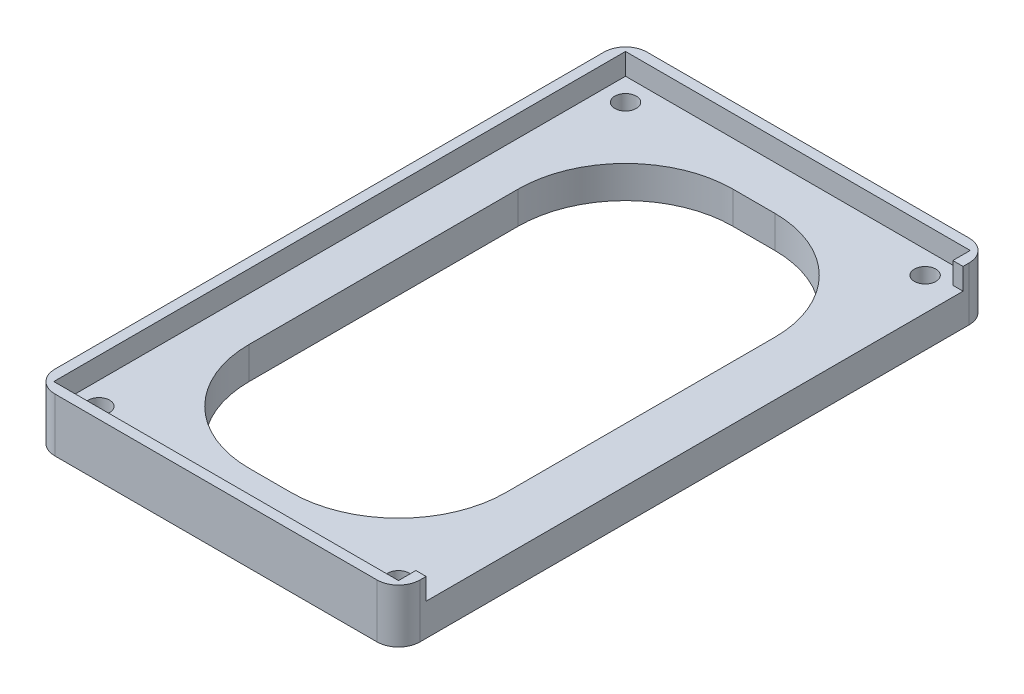
ISO-10303-21;
HEADER;
FILE_DESCRIPTION(('STEP AP214'),'2;1');
FILE_NAME('part.step','',(''),(''),'','','');
FILE_SCHEMA(('AUTOMOTIVE_DESIGN { 1 0 10303 214 1 1 1 1 }'));
ENDSEC;
DATA;
#1=APPLICATION_CONTEXT('core data for automotive mechanical design processes');
#2=APPLICATION_PROTOCOL_DEFINITION('international standard','automotive_design',2000,#1);
#3=PRODUCT_CONTEXT('',#1,'mechanical');
#4=PRODUCT('Part','Part','',(#3));
#5=PRODUCT_RELATED_PRODUCT_CATEGORY('part','',(#4));
#6=PRODUCT_DEFINITION_FORMATION('','',#4);
#7=PRODUCT_DEFINITION_CONTEXT('part definition',#1,'design');
#8=PRODUCT_DEFINITION('design','',#6,#7);
#9=PRODUCT_DEFINITION_SHAPE('','',#8);
#10=(LENGTH_UNIT() NAMED_UNIT(*) SI_UNIT(.MILLI.,.METRE.));
#11=(NAMED_UNIT(*) PLANE_ANGLE_UNIT() SI_UNIT($,.RADIAN.));
#12=(NAMED_UNIT(*) SI_UNIT($,.STERADIAN.) SOLID_ANGLE_UNIT());
#13=UNCERTAINTY_MEASURE_WITH_UNIT(LENGTH_MEASURE(1.E-05),#10,'distance_accuracy_value','');
#14=(GEOMETRIC_REPRESENTATION_CONTEXT(3) GLOBAL_UNCERTAINTY_ASSIGNED_CONTEXT((#13)) GLOBAL_UNIT_ASSIGNED_CONTEXT((#10,
#11,#12)) REPRESENTATION_CONTEXT('',''));
#15=CARTESIAN_POINT('',(0.,0.,0.));
#16=DIRECTION('',(0.,0.,1.));
#17=DIRECTION('',(1.,0.,0.));
#18=AXIS2_PLACEMENT_3D('',#15,#16,#17);
#19=CARTESIAN_POINT('',(15.05,10.,-15.05));
#20=DIRECTION('',(0.,1.,0.));
#21=DIRECTION('',(0.,0.,1.));
#22=AXIS2_PLACEMENT_3D('',#19,#20,#21);
#23=CYLINDRICAL_SURFACE('',#22,10.);
#24=DIRECTION('',(0.,1.,0.));
#25=VECTOR('',#24,1.);
#26=CARTESIAN_POINT('',(15.05,10.,-5.05));
#27=LINE('',#26,#25);
#28=CARTESIAN_POINT('',(15.05,0.,-5.05));
#29=VERTEX_POINT('',#28);
#30=CARTESIAN_POINT('',(15.05,3.,-5.05));
#31=VERTEX_POINT('',#30);
#32=EDGE_CURVE('E377',#29,#31,#27,.T.);
#33=ORIENTED_EDGE('',*,*,#32,.F.);
#34=CARTESIAN_POINT('',(15.05,0.,-15.05));
#35=DIRECTION('',(0.,-1.,0.));
#36=DIRECTION('',(0.,0.,-1.));
#37=AXIS2_PLACEMENT_3D('',#34,#35,#36);
#38=CIRCLE('',#37,10.);
#39=CARTESIAN_POINT('',(5.05,0.,-15.05));
#40=VERTEX_POINT('',#39);
#41=EDGE_CURVE('E54',#29,#40,#38,.T.);
#42=ORIENTED_EDGE('',*,*,#41,.T.);
#43=DIRECTION('',(0.,1.,0.));
#44=VECTOR('',#43,1.);
#45=CARTESIAN_POINT('',(5.05,10.,-15.05));
#46=LINE('',#45,#44);
#47=CARTESIAN_POINT('',(5.05,3.,-15.05));
#48=VERTEX_POINT('',#47);
#49=EDGE_CURVE('E381',#48,#40,#46,.F.);
#50=ORIENTED_EDGE('',*,*,#49,.F.);
#51=CARTESIAN_POINT('',(15.05,3.,-15.05));
#52=DIRECTION('',(0.,1.,0.));
#53=DIRECTION('',(0.,0.,1.));
#54=AXIS2_PLACEMENT_3D('',#51,#52,#53);
#55=CIRCLE('',#54,10.);
#56=EDGE_CURVE('E11',#48,#31,#55,.T.);
#57=ORIENTED_EDGE('',*,*,#56,.T.);
#58=EDGE_LOOP('',(#33,#42,#50,#57));
#59=FACE_BOUND('',#58,.T.);
#60=ADVANCED_FACE('F46',(#59),#23,.F.);
#61=CARTESIAN_POINT('',(18.95,10.,-15.05));
#62=DIRECTION('',(0.,-1.,0.));
#63=DIRECTION('',(0.,0.,-1.));
#64=AXIS2_PLACEMENT_3D('',#61,#62,#63);
#65=CYLINDRICAL_SURFACE('',#64,10.);
#66=DIRECTION('',(0.,1.,0.));
#67=VECTOR('',#66,1.);
#68=CARTESIAN_POINT('',(28.95,10.,-15.05));
#69=LINE('',#68,#67);
#70=CARTESIAN_POINT('',(28.95,0.,-15.05));
#71=VERTEX_POINT('',#70);
#72=CARTESIAN_POINT('',(28.95,3.,-15.05));
#73=VERTEX_POINT('',#72);
#74=EDGE_CURVE('E362',#71,#73,#69,.T.);
#75=ORIENTED_EDGE('',*,*,#74,.F.);
#76=CARTESIAN_POINT('',(18.95,0.,-15.05));
#77=DIRECTION('',(0.,-1.,0.));
#78=DIRECTION('',(0.,0.,-1.));
#79=AXIS2_PLACEMENT_3D('',#76,#77,#78);
#80=CIRCLE('',#79,10.);
#81=CARTESIAN_POINT('',(18.95,0.,-5.05));
#82=VERTEX_POINT('',#81);
#83=EDGE_CURVE('E370',#71,#82,#80,.T.);
#84=ORIENTED_EDGE('',*,*,#83,.T.);
#85=DIRECTION('',(0.,1.,0.));
#86=VECTOR('',#85,1.);
#87=CARTESIAN_POINT('',(18.95,10.,-5.05));
#88=LINE('',#87,#86);
#89=CARTESIAN_POINT('',(18.95,3.,-5.05));
#90=VERTEX_POINT('',#89);
#91=EDGE_CURVE('E366',#90,#82,#88,.F.);
#92=ORIENTED_EDGE('',*,*,#91,.F.);
#93=CARTESIAN_POINT('',(18.95,3.,-15.05));
#94=DIRECTION('',(0.,1.,0.));
#95=DIRECTION('',(0.,0.,1.));
#96=AXIS2_PLACEMENT_3D('',#93,#94,#95);
#97=CIRCLE('',#96,10.);
#98=EDGE_CURVE('E374',#90,#73,#97,.T.);
#99=ORIENTED_EDGE('',*,*,#98,.T.);
#100=EDGE_LOOP('',(#75,#84,#92,#99));
#101=FACE_BOUND('',#100,.T.);
#102=ADVANCED_FACE('F566',(#101),#65,.F.);
#103=CARTESIAN_POINT('',(15.05,10.,-40.09));
#104=DIRECTION('',(0.,1.,0.));
#105=DIRECTION('',(0.,0.,1.));
#106=AXIS2_PLACEMENT_3D('',#103,#104,#105);
#107=CYLINDRICAL_SURFACE('',#106,10.);
#108=DIRECTION('',(0.,-1.,0.));
#109=VECTOR('',#108,1.);
#110=CARTESIAN_POINT('',(15.05,10.,-50.09));
#111=LINE('',#110,#109);
#112=CARTESIAN_POINT('',(15.05,3.,-50.09));
#113=VERTEX_POINT('',#112);
#114=CARTESIAN_POINT('',(15.05,0.,-50.09));
#115=VERTEX_POINT('',#114);
#116=EDGE_CURVE('E348',#113,#115,#111,.T.);
#117=ORIENTED_EDGE('',*,*,#116,.F.);
#118=CARTESIAN_POINT('',(15.05,3.,-40.09));
#119=DIRECTION('',(0.,1.,0.));
#120=DIRECTION('',(0.,0.,1.));
#121=AXIS2_PLACEMENT_3D('',#118,#119,#120);
#122=CIRCLE('',#121,10.);
#123=CARTESIAN_POINT('',(5.05,3.,-40.09));
#124=VERTEX_POINT('',#123);
#125=EDGE_CURVE('E356',#113,#124,#122,.T.);
#126=ORIENTED_EDGE('',*,*,#125,.T.);
#127=DIRECTION('',(0.,-1.,0.));
#128=VECTOR('',#127,1.);
#129=CARTESIAN_POINT('',(5.05,10.,-40.09));
#130=LINE('',#129,#128);
#131=CARTESIAN_POINT('',(5.05,0.,-40.09));
#132=VERTEX_POINT('',#131);
#133=EDGE_CURVE('E352',#132,#124,#130,.F.);
#134=ORIENTED_EDGE('',*,*,#133,.F.);
#135=CARTESIAN_POINT('',(15.05,0.,-40.09));
#136=DIRECTION('',(0.,-1.,0.));
#137=DIRECTION('',(0.,0.,-1.));
#138=AXIS2_PLACEMENT_3D('',#135,#136,#137);
#139=CIRCLE('',#138,10.);
#140=EDGE_CURVE('E359',#132,#115,#139,.T.);
#141=ORIENTED_EDGE('',*,*,#140,.T.);
#142=EDGE_LOOP('',(#117,#126,#134,#141));
#143=FACE_BOUND('',#142,.T.);
#144=ADVANCED_FACE('F572',(#143),#107,.F.);
#145=CARTESIAN_POINT('',(18.95,10.,-40.09));
#146=DIRECTION('',(0.,-1.,0.));
#147=DIRECTION('',(0.,0.,-1.));
#148=AXIS2_PLACEMENT_3D('',#145,#146,#147);
#149=CYLINDRICAL_SURFACE('',#148,10.);
#150=DIRECTION('',(0.,-1.,0.));
#151=VECTOR('',#150,1.);
#152=CARTESIAN_POINT('',(28.95,10.,-40.09));
#153=LINE('',#152,#151);
#154=CARTESIAN_POINT('',(28.95,3.,-40.09));
#155=VERTEX_POINT('',#154);
#156=CARTESIAN_POINT('',(28.95,0.,-40.09));
#157=VERTEX_POINT('',#156);
#158=EDGE_CURVE('E333',#155,#157,#153,.T.);
#159=ORIENTED_EDGE('',*,*,#158,.F.);
#160=CARTESIAN_POINT('',(18.95,3.,-40.09));
#161=DIRECTION('',(0.,1.,0.));
#162=DIRECTION('',(0.,0.,1.));
#163=AXIS2_PLACEMENT_3D('',#160,#161,#162);
#164=CIRCLE('',#163,10.);
#165=CARTESIAN_POINT('',(18.95,3.,-50.09));
#166=VERTEX_POINT('',#165);
#167=EDGE_CURVE('E341',#155,#166,#164,.T.);
#168=ORIENTED_EDGE('',*,*,#167,.T.);
#169=DIRECTION('',(0.,-1.,0.));
#170=VECTOR('',#169,1.);
#171=CARTESIAN_POINT('',(18.95,10.,-50.09));
#172=LINE('',#171,#170);
#173=CARTESIAN_POINT('',(18.95,0.,-50.09));
#174=VERTEX_POINT('',#173);
#175=EDGE_CURVE('E337',#174,#166,#172,.F.);
#176=ORIENTED_EDGE('',*,*,#175,.F.);
#177=CARTESIAN_POINT('',(18.95,0.,-40.09));
#178=DIRECTION('',(0.,-1.,0.));
#179=DIRECTION('',(0.,0.,-1.));
#180=AXIS2_PLACEMENT_3D('',#177,#178,#179);
#181=CIRCLE('',#180,10.);
#182=EDGE_CURVE('E344',#174,#157,#181,.T.);
#183=ORIENTED_EDGE('',*,*,#182,.T.);
#184=EDGE_LOOP('',(#159,#168,#176,#183));
#185=FACE_BOUND('',#184,.T.);
#186=ADVANCED_FACE('F588',(#185),#149,.F.);
#187=CARTESIAN_POINT('',(0.,0.,0.));
#188=DIRECTION('',(0.,-1.,0.));
#189=DIRECTION('',(0.,0.,-1.));
#190=AXIS2_PLACEMENT_3D('',#187,#188,#189);
#191=PLANE('',#190);
#192=ORIENTED_EDGE('',*,*,#41,.F.);
#193=DIRECTION('',(1.,0.,0.));
#194=VECTOR('',#193,1.);
#195=CARTESIAN_POINT('',(0.,0.,-5.05));
#196=LINE('',#195,#194);
#197=EDGE_CURVE('E396',#29,#82,#196,.T.);
#198=ORIENTED_EDGE('',*,*,#197,.T.);
#199=ORIENTED_EDGE('',*,*,#83,.F.);
#200=DIRECTION('',(0.,0.,-1.));
#201=VECTOR('',#200,1.);
#202=CARTESIAN_POINT('',(28.95,0.,0.));
#203=LINE('',#202,#201);
#204=EDGE_CURVE('E400',#71,#157,#203,.T.);
#205=ORIENTED_EDGE('',*,*,#204,.T.);
#206=ORIENTED_EDGE('',*,*,#182,.F.);
#207=DIRECTION('',(1.,0.,0.));
#208=VECTOR('',#207,1.);
#209=CARTESIAN_POINT('',(0.,0.,-50.09));
#210=LINE('',#209,#208);
#211=EDGE_CURVE('E395',#115,#174,#210,.T.);
#212=ORIENTED_EDGE('',*,*,#211,.F.);
#213=ORIENTED_EDGE('',*,*,#140,.F.);
#214=DIRECTION('',(0.,0.,-1.));
#215=VECTOR('',#214,1.);
#216=CARTESIAN_POINT('',(5.05,0.,0.));
#217=LINE('',#216,#215);
#218=EDGE_CURVE('E387',#40,#132,#217,.T.);
#219=ORIENTED_EDGE('',*,*,#218,.F.);
#220=EDGE_LOOP('',(#192,#198,#199,#205,#206,#212,#213,#219));
#221=FACE_BOUND('',#220,.T.);
#222=CARTESIAN_POINT('',(32.,0.,-2.));
#223=DIRECTION('',(0.,-1.,0.));
#224=DIRECTION('',(0.,0.,-1.));
#225=AXIS2_PLACEMENT_3D('',#222,#223,#224);
#226=CIRCLE('',#225,2.);
#227=CARTESIAN_POINT('',(34.,0.,-2.));
#228=VERTEX_POINT('',#227);
#229=CARTESIAN_POINT('',(32.,0.,0.));
#230=VERTEX_POINT('',#229);
#231=EDGE_CURVE('E311',#228,#230,#226,.T.);
#232=ORIENTED_EDGE('',*,*,#231,.T.);
#233=DIRECTION('',(1.,0.,0.));
#234=VECTOR('',#233,1.);
#235=CARTESIAN_POINT('',(0.,0.,0.));
#236=LINE('',#235,#234);
#237=CARTESIAN_POINT('',(2.,0.,0.));
#238=VERTEX_POINT('',#237);
#239=EDGE_CURVE('E252',#238,#230,#236,.T.);
#240=ORIENTED_EDGE('',*,*,#239,.F.);
#241=CARTESIAN_POINT('',(2.,0.,-2.));
#242=DIRECTION('',(0.,-1.,0.));
#243=DIRECTION('',(0.,0.,-1.));
#244=AXIS2_PLACEMENT_3D('',#241,#242,#243);
#245=CIRCLE('',#244,2.);
#246=CARTESIAN_POINT('',(0.,0.,-2.));
#247=VERTEX_POINT('',#246);
#248=EDGE_CURVE('E272',#238,#247,#245,.T.);
#249=ORIENTED_EDGE('',*,*,#248,.T.);
#250=DIRECTION('',(0.,0.,1.));
#251=VECTOR('',#250,1.);
#252=CARTESIAN_POINT('',(0.,0.,0.));
#253=LINE('',#252,#251);
#254=CARTESIAN_POINT('',(0.,0.,-53.14));
#255=VERTEX_POINT('',#254);
#256=EDGE_CURVE('E249',#255,#247,#253,.T.);
#257=ORIENTED_EDGE('',*,*,#256,.F.);
#258=CARTESIAN_POINT('',(2.,0.,-53.14));
#259=DIRECTION('',(0.,-1.,0.));
#260=DIRECTION('',(0.,0.,-1.));
#261=AXIS2_PLACEMENT_3D('',#258,#259,#260);
#262=CIRCLE('',#261,2.);
#263=CARTESIAN_POINT('',(2.,0.,-55.14));
#264=VERTEX_POINT('',#263);
#265=EDGE_CURVE('E287',#255,#264,#262,.T.);
#266=ORIENTED_EDGE('',*,*,#265,.T.);
#267=DIRECTION('',(-1.,0.,0.));
#268=VECTOR('',#267,1.);
#269=CARTESIAN_POINT('',(0.,0.,-55.14));
#270=LINE('',#269,#268);
#271=CARTESIAN_POINT('',(32.,0.,-55.14));
#272=VERTEX_POINT('',#271);
#273=EDGE_CURVE('E259',#272,#264,#270,.T.);
#274=ORIENTED_EDGE('',*,*,#273,.F.);
#275=CARTESIAN_POINT('',(32.,0.,-53.14));
#276=DIRECTION('',(0.,-1.,0.));
#277=DIRECTION('',(0.,0.,-1.));
#278=AXIS2_PLACEMENT_3D('',#275,#276,#277);
#279=CIRCLE('',#278,2.);
#280=CARTESIAN_POINT('',(34.,0.,-53.14));
#281=VERTEX_POINT('',#280);
#282=EDGE_CURVE('E300',#272,#281,#279,.T.);
#283=ORIENTED_EDGE('',*,*,#282,.T.);
#284=DIRECTION('',(0.,0.,-1.));
#285=VECTOR('',#284,1.);
#286=CARTESIAN_POINT('',(34.,0.,0.));
#287=LINE('',#286,#285);
#288=EDGE_CURVE('E256',#228,#281,#287,.T.);
#289=ORIENTED_EDGE('',*,*,#288,.F.);
#290=EDGE_LOOP('',(#232,#240,#249,#257,#266,#274,#283,#289));
#291=FACE_BOUND('',#290,.T.);
#292=CARTESIAN_POINT('',(30.95,0.,-52.09));
#293=DIRECTION('',(0.,-1.,0.));
#294=DIRECTION('',(0.,0.,-1.));
#295=AXIS2_PLACEMENT_3D('',#292,#293,#294);
#296=CIRCLE('',#295,0.999999999999998);
#297=CARTESIAN_POINT('',(30.95,0.,-53.09));
#298=VERTEX_POINT('',#297);
#299=EDGE_CURVE('E434',#298,#298,#296,.F.);
#300=ORIENTED_EDGE('',*,*,#299,.T.);
#301=EDGE_LOOP('',(#300));
#302=FACE_BOUND('',#301,.T.);
#303=CARTESIAN_POINT('',(30.9500000000004,0.,-3.05));
#304=DIRECTION('',(0.,-1.,0.));
#305=DIRECTION('',(0.,0.,-1.));
#306=AXIS2_PLACEMENT_3D('',#303,#304,#305);
#307=CIRCLE('',#306,0.999999999999995);
#308=CARTESIAN_POINT('',(30.9500000000004,0.,-4.04999999999999));
#309=VERTEX_POINT('',#308);
#310=EDGE_CURVE('E430',#309,#309,#307,.T.);
#311=ORIENTED_EDGE('',*,*,#310,.F.);
#312=EDGE_LOOP('',(#311));
#313=FACE_BOUND('',#312,.T.);
#314=CARTESIAN_POINT('',(3.05,0.,-52.09));
#315=DIRECTION('',(0.,-1.,0.));
#316=DIRECTION('',(0.,0.,-1.));
#317=AXIS2_PLACEMENT_3D('',#314,#315,#316);
#318=CIRCLE('',#317,1.);
#319=CARTESIAN_POINT('',(3.05,0.,-53.09));
#320=VERTEX_POINT('',#319);
#321=EDGE_CURVE('E438',#320,#320,#318,.T.);
#322=ORIENTED_EDGE('',*,*,#321,.F.);
#323=EDGE_LOOP('',(#322));
#324=FACE_BOUND('',#323,.T.);
#325=CARTESIAN_POINT('',(3.05,0.,-3.05));
#326=DIRECTION('',(0.,-1.,0.));
#327=DIRECTION('',(0.,0.,-1.));
#328=AXIS2_PLACEMENT_3D('',#325,#326,#327);
#329=CIRCLE('',#328,1.);
#330=CARTESIAN_POINT('',(3.05,0.,-4.05));
#331=VERTEX_POINT('',#330);
#332=EDGE_CURVE('E442',#331,#331,#329,.F.);
#333=ORIENTED_EDGE('',*,*,#332,.T.);
#334=EDGE_LOOP('',(#333));
#335=FACE_BOUND('',#334,.T.);
#336=ADVANCED_FACE('F390',(#221,#291,#302,#313,#324,#335),#191,.T.);
#337=CARTESIAN_POINT('',(0.,3.,0.));
#338=DIRECTION('',(0.,1.,0.));
#339=DIRECTION('',(0.,0.,1.));
#340=AXIS2_PLACEMENT_3D('',#337,#338,#339);
#341=PLANE('',#340);
#342=ORIENTED_EDGE('',*,*,#98,.F.);
#343=DIRECTION('',(-1.,0.,0.));
#344=VECTOR('',#343,1.);
#345=CARTESIAN_POINT('',(0.,3.,-5.05));
#346=LINE('',#345,#344);
#347=EDGE_CURVE('E330',#90,#31,#346,.T.);
#348=ORIENTED_EDGE('',*,*,#347,.T.);
#349=ORIENTED_EDGE('',*,*,#56,.F.);
#350=DIRECTION('',(0.,0.,1.));
#351=VECTOR('',#350,1.);
#352=CARTESIAN_POINT('',(5.05,3.,0.));
#353=LINE('',#352,#351);
#354=EDGE_CURVE('E318',#124,#48,#353,.T.);
#355=ORIENTED_EDGE('',*,*,#354,.F.);
#356=ORIENTED_EDGE('',*,*,#125,.F.);
#357=DIRECTION('',(-1.,0.,0.));
#358=VECTOR('',#357,1.);
#359=CARTESIAN_POINT('',(0.,3.,-50.09));
#360=LINE('',#359,#358);
#361=EDGE_CURVE('E322',#166,#113,#360,.T.);
#362=ORIENTED_EDGE('',*,*,#361,.F.);
#363=ORIENTED_EDGE('',*,*,#167,.F.);
#364=DIRECTION('',(0.,0.,1.));
#365=VECTOR('',#364,1.);
#366=CARTESIAN_POINT('',(28.95,3.,0.));
#367=LINE('',#366,#365);
#368=EDGE_CURVE('E326',#155,#73,#367,.T.);
#369=ORIENTED_EDGE('',*,*,#368,.T.);
#370=EDGE_LOOP('',(#342,#348,#349,#355,#356,#362,#363,#369));
#371=FACE_BOUND('',#370,.T.);
#372=DIRECTION('',(0.,0.,1.));
#373=VECTOR('',#372,1.);
#374=CARTESIAN_POINT('',(33.05,3.,0.));
#375=LINE('',#374,#373);
#376=CARTESIAN_POINT('',(33.05,3.,-2.56999999999999));
#377=VERTEX_POINT('',#376);
#378=CARTESIAN_POINT('',(33.05,3.,-0.95));
#379=VERTEX_POINT('',#378);
#380=EDGE_CURVE('E469',#377,#379,#375,.T.);
#381=ORIENTED_EDGE('',*,*,#380,.F.);
#382=DIRECTION('',(-1.,0.,0.));
#383=VECTOR('',#382,1.);
#384=CARTESIAN_POINT('',(32.,3.,-2.56999999999999));
#385=LINE('',#384,#383);
#386=CARTESIAN_POINT('',(34.,3.,-2.56999999999999));
#387=VERTEX_POINT('',#386);
#388=EDGE_CURVE('E411',#387,#377,#385,.T.);
#389=ORIENTED_EDGE('',*,*,#388,.F.);
#390=DIRECTION('',(0.,0.,1.));
#391=VECTOR('',#390,1.);
#392=CARTESIAN_POINT('',(34.,3.,-2.56999999999999));
#393=LINE('',#392,#391);
#394=CARTESIAN_POINT('',(34.,3.,-52.57));
#395=VERTEX_POINT('',#394);
#396=EDGE_CURVE('E408',#395,#387,#393,.T.);
#397=ORIENTED_EDGE('',*,*,#396,.F.);
#398=DIRECTION('',(1.,0.,0.));
#399=VECTOR('',#398,1.);
#400=CARTESIAN_POINT('',(32.,3.,-52.57));
#401=LINE('',#400,#399);
#402=CARTESIAN_POINT('',(33.05,3.,-52.57));
#403=VERTEX_POINT('',#402);
#404=EDGE_CURVE('E210',#403,#395,#401,.T.);
#405=ORIENTED_EDGE('',*,*,#404,.F.);
#406=CARTESIAN_POINT('',(33.05,3.,-54.19));
#407=VERTEX_POINT('',#406);
#408=EDGE_CURVE('E470',#407,#403,#375,.T.);
#409=ORIENTED_EDGE('',*,*,#408,.F.);
#410=DIRECTION('',(1.,0.,0.));
#411=VECTOR('',#410,1.);
#412=CARTESIAN_POINT('',(0.,3.,-54.19));
#413=LINE('',#412,#411);
#414=CARTESIAN_POINT('',(0.95,3.,-54.19));
#415=VERTEX_POINT('',#414);
#416=EDGE_CURVE('E457',#415,#407,#413,.T.);
#417=ORIENTED_EDGE('',*,*,#416,.F.);
#418=DIRECTION('',(0.,0.,1.));
#419=VECTOR('',#418,1.);
#420=CARTESIAN_POINT('',(0.95,3.,0.));
#421=LINE('',#420,#419);
#422=CARTESIAN_POINT('',(0.95,3.,-0.95));
#423=VERTEX_POINT('',#422);
#424=EDGE_CURVE('E461',#415,#423,#421,.T.);
#425=ORIENTED_EDGE('',*,*,#424,.T.);
#426=DIRECTION('',(1.,0.,0.));
#427=VECTOR('',#426,1.);
#428=CARTESIAN_POINT('',(0.,3.,-0.95));
#429=LINE('',#428,#427);
#430=EDGE_CURVE('E465',#423,#379,#429,.T.);
#431=ORIENTED_EDGE('',*,*,#430,.T.);
#432=EDGE_LOOP('',(#381,#389,#397,#405,#409,#417,#425,#431));
#433=FACE_BOUND('',#432,.T.);
#434=CARTESIAN_POINT('',(30.95,3.,-52.09));
#435=DIRECTION('',(0.,-1.,0.));
#436=DIRECTION('',(0.,0.,-1.));
#437=AXIS2_PLACEMENT_3D('',#434,#435,#436);
#438=CIRCLE('',#437,0.999999999999998);
#439=CARTESIAN_POINT('',(30.95,3.,-53.09));
#440=VERTEX_POINT('',#439);
#441=EDGE_CURVE('E415',#440,#440,#438,.T.);
#442=ORIENTED_EDGE('',*,*,#441,.T.);
#443=EDGE_LOOP('',(#442));
#444=FACE_BOUND('',#443,.T.);
#445=CARTESIAN_POINT('',(30.9500000000004,3.,-3.05));
#446=DIRECTION('',(0.,1.,0.));
#447=DIRECTION('',(0.,0.,1.));
#448=AXIS2_PLACEMENT_3D('',#445,#446,#447);
#449=CIRCLE('',#448,0.999999999999995);
#450=CARTESIAN_POINT('',(30.9500000000004,3.,-2.05));
#451=VERTEX_POINT('',#450);
#452=EDGE_CURVE('E419',#451,#451,#449,.T.);
#453=ORIENTED_EDGE('',*,*,#452,.F.);
#454=EDGE_LOOP('',(#453));
#455=FACE_BOUND('',#454,.T.);
#456=CARTESIAN_POINT('',(3.05,3.,-52.09));
#457=DIRECTION('',(0.,1.,0.));
#458=DIRECTION('',(0.,0.,1.));
#459=AXIS2_PLACEMENT_3D('',#456,#457,#458);
#460=CIRCLE('',#459,1.);
#461=CARTESIAN_POINT('',(3.05,3.,-51.09));
#462=VERTEX_POINT('',#461);
#463=EDGE_CURVE('E420',#462,#462,#460,.T.);
#464=ORIENTED_EDGE('',*,*,#463,.F.);
#465=EDGE_LOOP('',(#464));
#466=FACE_BOUND('',#465,.T.);
#467=CARTESIAN_POINT('',(3.05,3.,-3.05));
#468=DIRECTION('',(0.,-1.,0.));
#469=DIRECTION('',(0.,0.,-1.));
#470=AXIS2_PLACEMENT_3D('',#467,#468,#469);
#471=CIRCLE('',#470,1.);
#472=CARTESIAN_POINT('',(3.05,3.,-4.05));
#473=VERTEX_POINT('',#472);
#474=EDGE_CURVE('E414',#473,#473,#471,.T.);
#475=ORIENTED_EDGE('',*,*,#474,.T.);
#476=EDGE_LOOP('',(#475));
#477=FACE_BOUND('',#476,.T.);
#478=ADVANCED_FACE('F541',(#371,#433,#444,#455,#466,#477),#341,.T.);
#479=CARTESIAN_POINT('',(0.,5.,0.));
#480=DIRECTION('',(0.,0.,-1.));
#481=DIRECTION('',(-1.,0.,0.));
#482=AXIS2_PLACEMENT_3D('',#479,#480,#481);
#483=PLANE('',#482);
#484=ORIENTED_EDGE('',*,*,#239,.T.);
#485=DIRECTION('',(0.,1.,0.));
#486=VECTOR('',#485,1.);
#487=CARTESIAN_POINT('',(32.,5.,0.));
#488=LINE('',#487,#486);
#489=CARTESIAN_POINT('',(32.,5.,0.));
#490=VERTEX_POINT('',#489);
#491=EDGE_CURVE('E303',#230,#490,#488,.T.);
#492=ORIENTED_EDGE('',*,*,#491,.T.);
#493=DIRECTION('',(1.,0.,0.));
#494=VECTOR('',#493,1.);
#495=CARTESIAN_POINT('',(0.,5.,0.));
#496=LINE('',#495,#494);
#497=CARTESIAN_POINT('',(2.,5.,0.));
#498=VERTEX_POINT('',#497);
#499=EDGE_CURVE('E237',#498,#490,#496,.T.);
#500=ORIENTED_EDGE('',*,*,#499,.F.);
#501=DIRECTION('',(0.,-1.,0.));
#502=VECTOR('',#501,1.);
#503=CARTESIAN_POINT('',(2.,5.,0.));
#504=LINE('',#503,#502);
#505=EDGE_CURVE('E248',#498,#238,#504,.T.);
#506=ORIENTED_EDGE('',*,*,#505,.T.);
#507=EDGE_LOOP('',(#484,#492,#500,#506));
#508=FACE_BOUND('',#507,.T.);
#509=ADVANCED_FACE('F516',(#508),#483,.F.);
#510=CARTESIAN_POINT('',(0.,5.,-55.14));
#511=DIRECTION('',(0.,0.,1.));
#512=DIRECTION('',(1.,0.,0.));
#513=AXIS2_PLACEMENT_3D('',#510,#511,#512);
#514=PLANE('',#513);
#515=ORIENTED_EDGE('',*,*,#273,.T.);
#516=DIRECTION('',(0.,-1.,0.));
#517=VECTOR('',#516,1.);
#518=CARTESIAN_POINT('',(2.,5.,-55.14));
#519=LINE('',#518,#517);
#520=CARTESIAN_POINT('',(2.,5.,-55.14));
#521=VERTEX_POINT('',#520);
#522=EDGE_CURVE('E280',#264,#521,#519,.F.);
#523=ORIENTED_EDGE('',*,*,#522,.T.);
#524=DIRECTION('',(-1.,0.,0.));
#525=VECTOR('',#524,1.);
#526=CARTESIAN_POINT('',(0.,5.,-55.14));
#527=LINE('',#526,#525);
#528=CARTESIAN_POINT('',(32.,5.,-55.14));
#529=VERTEX_POINT('',#528);
#530=EDGE_CURVE('E241',#529,#521,#527,.T.);
#531=ORIENTED_EDGE('',*,*,#530,.F.);
#532=DIRECTION('',(0.,-1.,0.));
#533=VECTOR('',#532,1.);
#534=CARTESIAN_POINT('',(32.,5.,-55.14));
#535=LINE('',#534,#533);
#536=EDGE_CURVE('E291',#529,#272,#535,.T.);
#537=ORIENTED_EDGE('',*,*,#536,.T.);
#538=EDGE_LOOP('',(#515,#523,#531,#537));
#539=FACE_BOUND('',#538,.T.);
#540=ADVANCED_FACE('F617',(#539),#514,.F.);
#541=CARTESIAN_POINT('',(32.,10.,-2.56999999999999));
#542=DIRECTION('',(0.,0.,1.));
#543=DIRECTION('',(1.,0.,0.));
#544=AXIS2_PLACEMENT_3D('',#541,#542,#543);
#545=PLANE('',#544);
#546=ORIENTED_EDGE('',*,*,#388,.T.);
#547=DIRECTION('',(0.,1.,0.));
#548=VECTOR('',#547,1.);
#549=CARTESIAN_POINT('',(33.05,3.,-2.56999999999999));
#550=LINE('',#549,#548);
#551=CARTESIAN_POINT('',(33.05,5.,-2.56999999999999));
#552=VERTEX_POINT('',#551);
#553=EDGE_CURVE('E228',#377,#552,#550,.T.);
#554=ORIENTED_EDGE('',*,*,#553,.T.);
#555=DIRECTION('',(-1.,0.,0.));
#556=VECTOR('',#555,1.);
#557=CARTESIAN_POINT('',(0.,5.,-2.56999999999999));
#558=LINE('',#557,#556);
#559=CARTESIAN_POINT('',(34.,5.,-2.56999999999999));
#560=VERTEX_POINT('',#559);
#561=EDGE_CURVE('E452',#560,#552,#558,.T.);
#562=ORIENTED_EDGE('',*,*,#561,.F.);
#563=DIRECTION('',(0.,-1.,0.));
#564=VECTOR('',#563,1.);
#565=CARTESIAN_POINT('',(34.,10.,-2.56999999999999));
#566=LINE('',#565,#564);
#567=EDGE_CURVE('E217',#560,#387,#566,.T.);
#568=ORIENTED_EDGE('',*,*,#567,.T.);
#569=EDGE_LOOP('',(#546,#554,#562,#568));
#570=FACE_BOUND('',#569,.T.);
#571=ADVANCED_FACE('F527',(#570),#545,.F.);
#572=CARTESIAN_POINT('',(32.,10.,-52.57));
#573=DIRECTION('',(0.,0.,-1.));
#574=DIRECTION('',(-1.,0.,0.));
#575=AXIS2_PLACEMENT_3D('',#572,#573,#574);
#576=PLANE('',#575);
#577=ORIENTED_EDGE('',*,*,#404,.T.);
#578=DIRECTION('',(0.,1.,0.));
#579=VECTOR('',#578,1.);
#580=CARTESIAN_POINT('',(34.,10.,-52.57));
#581=LINE('',#580,#579);
#582=CARTESIAN_POINT('',(34.,5.,-52.57));
#583=VERTEX_POINT('',#582);
#584=EDGE_CURVE('E204',#395,#583,#581,.T.);
#585=ORIENTED_EDGE('',*,*,#584,.T.);
#586=DIRECTION('',(1.,0.,0.));
#587=VECTOR('',#586,1.);
#588=CARTESIAN_POINT('',(0.,5.,-52.57));
#589=LINE('',#588,#587);
#590=CARTESIAN_POINT('',(33.05,5.,-52.57));
#591=VERTEX_POINT('',#590);
#592=EDGE_CURVE('E207',#591,#583,#589,.T.);
#593=ORIENTED_EDGE('',*,*,#592,.F.);
#594=DIRECTION('',(0.,-1.,0.));
#595=VECTOR('',#594,1.);
#596=CARTESIAN_POINT('',(33.05,3.,-52.57));
#597=LINE('',#596,#595);
#598=EDGE_CURVE('E216',#591,#403,#597,.T.);
#599=ORIENTED_EDGE('',*,*,#598,.T.);
#600=EDGE_LOOP('',(#577,#585,#593,#599));
#601=FACE_BOUND('',#600,.T.);
#602=ADVANCED_FACE('F206',(#601),#576,.F.);
#603=CARTESIAN_POINT('',(32.,5.,-2.));
#604=DIRECTION('',(0.,1.,0.));
#605=DIRECTION('',(0.,0.,1.));
#606=AXIS2_PLACEMENT_3D('',#603,#604,#605);
#607=CYLINDRICAL_SURFACE('',#606,2.);
#608=ORIENTED_EDGE('',*,*,#491,.F.);
#609=ORIENTED_EDGE('',*,*,#231,.F.);
#610=DIRECTION('',(0.,1.,0.));
#611=VECTOR('',#610,1.);
#612=CARTESIAN_POINT('',(34.,5.,-2.));
#613=LINE('',#612,#611);
#614=CARTESIAN_POINT('',(34.,5.,-2.));
#615=VERTEX_POINT('',#614);
#616=EDGE_CURVE('E307',#615,#228,#613,.F.);
#617=ORIENTED_EDGE('',*,*,#616,.F.);
#618=CARTESIAN_POINT('',(32.,5.,-2.));
#619=DIRECTION('',(0.,-1.,0.));
#620=DIRECTION('',(0.,0.,-1.));
#621=AXIS2_PLACEMENT_3D('',#618,#619,#620);
#622=CIRCLE('',#621,2.);
#623=EDGE_CURVE('E315',#490,#615,#622,.F.);
#624=ORIENTED_EDGE('',*,*,#623,.F.);
#625=EDGE_LOOP('',(#608,#609,#617,#624));
#626=FACE_BOUND('',#625,.T.);
#627=ADVANCED_FACE('F523',(#626),#607,.T.);
#628=CARTESIAN_POINT('',(32.,5.,-53.14));
#629=DIRECTION('',(0.,-1.,0.));
#630=DIRECTION('',(0.,0.,-1.));
#631=AXIS2_PLACEMENT_3D('',#628,#629,#630);
#632=CYLINDRICAL_SURFACE('',#631,2.);
#633=ORIENTED_EDGE('',*,*,#536,.F.);
#634=CARTESIAN_POINT('',(32.,5.,-53.14));
#635=DIRECTION('',(0.,-1.,0.));
#636=DIRECTION('',(0.,0.,-1.));
#637=AXIS2_PLACEMENT_3D('',#634,#635,#636);
#638=CIRCLE('',#637,2.);
#639=CARTESIAN_POINT('',(34.,5.,-53.14));
#640=VERTEX_POINT('',#639);
#641=EDGE_CURVE('E297',#640,#529,#638,.F.);
#642=ORIENTED_EDGE('',*,*,#641,.F.);
#643=DIRECTION('',(0.,-1.,0.));
#644=VECTOR('',#643,1.);
#645=CARTESIAN_POINT('',(34.,5.,-53.14));
#646=LINE('',#645,#644);
#647=EDGE_CURVE('E234',#281,#640,#646,.F.);
#648=ORIENTED_EDGE('',*,*,#647,.F.);
#649=ORIENTED_EDGE('',*,*,#282,.F.);
#650=EDGE_LOOP('',(#633,#642,#648,#649));
#651=FACE_BOUND('',#650,.T.);
#652=ADVANCED_FACE('F604',(#651),#632,.T.);
#653=CARTESIAN_POINT('',(2.,5.,-53.14));
#654=DIRECTION('',(0.,-1.,0.));
#655=DIRECTION('',(0.,0.,-1.));
#656=AXIS2_PLACEMENT_3D('',#653,#654,#655);
#657=CYLINDRICAL_SURFACE('',#656,2.);
#658=DIRECTION('',(0.,-1.,0.));
#659=VECTOR('',#658,1.);
#660=CARTESIAN_POINT('',(0.,5.,-53.14));
#661=LINE('',#660,#659);
#662=CARTESIAN_POINT('',(0.,5.,-53.14));
#663=VERTEX_POINT('',#662);
#664=EDGE_CURVE('E276',#663,#255,#661,.T.);
#665=ORIENTED_EDGE('',*,*,#664,.F.);
#666=CARTESIAN_POINT('',(2.,5.,-53.14));
#667=DIRECTION('',(0.,-1.,0.));
#668=DIRECTION('',(0.,0.,-1.));
#669=AXIS2_PLACEMENT_3D('',#666,#667,#668);
#670=CIRCLE('',#669,2.);
#671=EDGE_CURVE('E284',#521,#663,#670,.F.);
#672=ORIENTED_EDGE('',*,*,#671,.F.);
#673=ORIENTED_EDGE('',*,*,#522,.F.);
#674=ORIENTED_EDGE('',*,*,#265,.F.);
#675=EDGE_LOOP('',(#665,#672,#673,#674));
#676=FACE_BOUND('',#675,.T.);
#677=ADVANCED_FACE('F607',(#676),#657,.T.);
#678=CARTESIAN_POINT('',(2.,5.,-2.));
#679=DIRECTION('',(0.,-1.,0.));
#680=DIRECTION('',(0.,0.,-1.));
#681=AXIS2_PLACEMENT_3D('',#678,#679,#680);
#682=CYLINDRICAL_SURFACE('',#681,2.);
#683=ORIENTED_EDGE('',*,*,#505,.F.);
#684=CARTESIAN_POINT('',(2.,5.,-2.));
#685=DIRECTION('',(0.,-1.,0.));
#686=DIRECTION('',(0.,0.,-1.));
#687=AXIS2_PLACEMENT_3D('',#684,#685,#686);
#688=CIRCLE('',#687,2.);
#689=CARTESIAN_POINT('',(0.,5.,-2.));
#690=VERTEX_POINT('',#689);
#691=EDGE_CURVE('E269',#690,#498,#688,.F.);
#692=ORIENTED_EDGE('',*,*,#691,.F.);
#693=DIRECTION('',(0.,-1.,0.));
#694=VECTOR('',#693,1.);
#695=CARTESIAN_POINT('',(0.,5.,-2.));
#696=LINE('',#695,#694);
#697=EDGE_CURVE('E265',#247,#690,#696,.F.);
#698=ORIENTED_EDGE('',*,*,#697,.F.);
#699=ORIENTED_EDGE('',*,*,#248,.F.);
#700=EDGE_LOOP('',(#683,#692,#698,#699));
#701=FACE_BOUND('',#700,.T.);
#702=ADVANCED_FACE('F509',(#701),#682,.T.);
#703=CARTESIAN_POINT('',(33.05,3.,0.));
#704=DIRECTION('',(-1.,0.,0.));
#705=DIRECTION('',(0.,0.,1.));
#706=AXIS2_PLACEMENT_3D('',#703,#704,#705);
#707=PLANE('',#706);
#708=ORIENTED_EDGE('',*,*,#553,.F.);
#709=ORIENTED_EDGE('',*,*,#380,.T.);
#710=DIRECTION('',(0.,1.,0.));
#711=VECTOR('',#710,1.);
#712=CARTESIAN_POINT('',(33.05,3.,-0.95));
#713=LINE('',#712,#711);
#714=CARTESIAN_POINT('',(33.05,5.,-0.95));
#715=VERTEX_POINT('',#714);
#716=EDGE_CURVE('E491',#379,#715,#713,.T.);
#717=ORIENTED_EDGE('',*,*,#716,.T.);
#718=DIRECTION('',(0.,0.,1.));
#719=VECTOR('',#718,1.);
#720=CARTESIAN_POINT('',(33.05,5.,0.));
#721=LINE('',#720,#719);
#722=EDGE_CURVE('E485',#552,#715,#721,.T.);
#723=ORIENTED_EDGE('',*,*,#722,.F.);
#724=EDGE_LOOP('',(#708,#709,#717,#723));
#725=FACE_BOUND('',#724,.T.);
#726=ADVANCED_FACE('F532',(#725),#707,.T.);
#727=CARTESIAN_POINT('',(0.,5.,0.));
#728=DIRECTION('',(0.,-1.,0.));
#729=DIRECTION('',(0.,0.,-1.));
#730=AXIS2_PLACEMENT_3D('',#727,#728,#729);
#731=PLANE('',#730);
#732=ORIENTED_EDGE('',*,*,#499,.T.);
#733=ORIENTED_EDGE('',*,*,#623,.T.);
#734=DIRECTION('',(0.,0.,-1.));
#735=VECTOR('',#734,1.);
#736=CARTESIAN_POINT('',(34.,5.,0.));
#737=LINE('',#736,#735);
#738=EDGE_CURVE('E236',#615,#560,#737,.T.);
#739=ORIENTED_EDGE('',*,*,#738,.T.);
#740=ORIENTED_EDGE('',*,*,#561,.T.);
#741=ORIENTED_EDGE('',*,*,#722,.T.);
#742=DIRECTION('',(1.,0.,0.));
#743=VECTOR('',#742,1.);
#744=CARTESIAN_POINT('',(0.,5.,-0.95));
#745=LINE('',#744,#743);
#746=CARTESIAN_POINT('',(0.95,5.,-0.95));
#747=VERTEX_POINT('',#746);
#748=EDGE_CURVE('E481',#747,#715,#745,.T.);
#749=ORIENTED_EDGE('',*,*,#748,.F.);
#750=DIRECTION('',(0.,0.,1.));
#751=VECTOR('',#750,1.);
#752=CARTESIAN_POINT('',(0.95,5.,0.));
#753=LINE('',#752,#751);
#754=CARTESIAN_POINT('',(0.95,5.,-54.19));
#755=VERTEX_POINT('',#754);
#756=EDGE_CURVE('E477',#755,#747,#753,.T.);
#757=ORIENTED_EDGE('',*,*,#756,.F.);
#758=DIRECTION('',(1.,0.,0.));
#759=VECTOR('',#758,1.);
#760=CARTESIAN_POINT('',(0.,5.,-54.19));
#761=LINE('',#760,#759);
#762=CARTESIAN_POINT('',(33.05,5.,-54.19));
#763=VERTEX_POINT('',#762);
#764=EDGE_CURVE('E456',#755,#763,#761,.T.);
#765=ORIENTED_EDGE('',*,*,#764,.T.);
#766=EDGE_CURVE('E226',#763,#591,#721,.T.);
#767=ORIENTED_EDGE('',*,*,#766,.T.);
#768=ORIENTED_EDGE('',*,*,#592,.T.);
#769=EDGE_CURVE('E224',#583,#640,#737,.T.);
#770=ORIENTED_EDGE('',*,*,#769,.T.);
#771=ORIENTED_EDGE('',*,*,#641,.T.);
#772=ORIENTED_EDGE('',*,*,#530,.T.);
#773=ORIENTED_EDGE('',*,*,#671,.T.);
#774=DIRECTION('',(0.,0.,1.));
#775=VECTOR('',#774,1.);
#776=CARTESIAN_POINT('',(0.,5.,0.));
#777=LINE('',#776,#775);
#778=EDGE_CURVE('E242',#663,#690,#777,.T.);
#779=ORIENTED_EDGE('',*,*,#778,.T.);
#780=ORIENTED_EDGE('',*,*,#691,.T.);
#781=EDGE_LOOP('',(#732,#733,#739,#740,#741,#749,#757,#765,#767,#768,#770,#771,#772,#773,#779,#780));
#782=FACE_BOUND('',#781,.T.);
#783=ADVANCED_FACE('F223',(#782),#731,.F.);
#784=CARTESIAN_POINT('',(0.,5.,0.));
#785=DIRECTION('',(1.,0.,0.));
#786=DIRECTION('',(0.,0.,-1.));
#787=AXIS2_PLACEMENT_3D('',#784,#785,#786);
#788=PLANE('',#787);
#789=ORIENTED_EDGE('',*,*,#778,.F.);
#790=ORIENTED_EDGE('',*,*,#664,.T.);
#791=ORIENTED_EDGE('',*,*,#256,.T.);
#792=ORIENTED_EDGE('',*,*,#697,.T.);
#793=EDGE_LOOP('',(#789,#790,#791,#792));
#794=FACE_BOUND('',#793,.T.);
#795=ADVANCED_FACE('F511',(#794),#788,.F.);
#796=CARTESIAN_POINT('',(34.,5.,0.));
#797=DIRECTION('',(-1.,0.,0.));
#798=DIRECTION('',(0.,0.,1.));
#799=AXIS2_PLACEMENT_3D('',#796,#797,#798);
#800=PLANE('',#799);
#801=ORIENTED_EDGE('',*,*,#288,.T.);
#802=ORIENTED_EDGE('',*,*,#647,.T.);
#803=ORIENTED_EDGE('',*,*,#769,.F.);
#804=ORIENTED_EDGE('',*,*,#584,.F.);
#805=ORIENTED_EDGE('',*,*,#396,.T.);
#806=ORIENTED_EDGE('',*,*,#567,.F.);
#807=ORIENTED_EDGE('',*,*,#738,.F.);
#808=ORIENTED_EDGE('',*,*,#616,.T.);
#809=EDGE_LOOP('',(#801,#802,#803,#804,#805,#806,#807,#808));
#810=FACE_BOUND('',#809,.T.);
#811=ADVANCED_FACE('F232',(#810),#800,.F.);
#812=CARTESIAN_POINT('',(0.,3.,-54.19));
#813=DIRECTION('',(0.,0.,1.));
#814=DIRECTION('',(1.,0.,0.));
#815=AXIS2_PLACEMENT_3D('',#812,#813,#814);
#816=PLANE('',#815);
#817=ORIENTED_EDGE('',*,*,#764,.F.);
#818=DIRECTION('',(0.,1.,0.));
#819=VECTOR('',#818,1.);
#820=CARTESIAN_POINT('',(0.95,3.,-54.19));
#821=LINE('',#820,#819);
#822=EDGE_CURVE('E474',#415,#755,#821,.T.);
#823=ORIENTED_EDGE('',*,*,#822,.F.);
#824=ORIENTED_EDGE('',*,*,#416,.T.);
#825=DIRECTION('',(0.,1.,0.));
#826=VECTOR('',#825,1.);
#827=CARTESIAN_POINT('',(33.05,3.,-54.19));
#828=LINE('',#827,#826);
#829=EDGE_CURVE('E253',#407,#763,#828,.T.);
#830=ORIENTED_EDGE('',*,*,#829,.T.);
#831=EDGE_LOOP('',(#817,#823,#824,#830));
#832=FACE_BOUND('',#831,.T.);
#833=ADVANCED_FACE('F549',(#832),#816,.T.);
#834=ORIENTED_EDGE('',*,*,#598,.F.);
#835=ORIENTED_EDGE('',*,*,#766,.F.);
#836=ORIENTED_EDGE('',*,*,#829,.F.);
#837=ORIENTED_EDGE('',*,*,#408,.T.);
#838=EDGE_LOOP('',(#834,#835,#836,#837));
#839=FACE_BOUND('',#838,.T.);
#840=ADVANCED_FACE('F552',(#839),#707,.T.);
#841=CARTESIAN_POINT('',(0.,3.,-0.95));
#842=DIRECTION('',(0.,0.,1.));
#843=DIRECTION('',(1.,0.,0.));
#844=AXIS2_PLACEMENT_3D('',#841,#842,#843);
#845=PLANE('',#844);
#846=ORIENTED_EDGE('',*,*,#748,.T.);
#847=ORIENTED_EDGE('',*,*,#716,.F.);
#848=ORIENTED_EDGE('',*,*,#430,.F.);
#849=DIRECTION('',(0.,1.,0.));
#850=VECTOR('',#849,1.);
#851=CARTESIAN_POINT('',(0.95,3.,-0.95));
#852=LINE('',#851,#850);
#853=EDGE_CURVE('E495',#423,#747,#852,.T.);
#854=ORIENTED_EDGE('',*,*,#853,.T.);
#855=EDGE_LOOP('',(#846,#847,#848,#854));
#856=FACE_BOUND('',#855,.T.);
#857=ADVANCED_FACE('F540',(#856),#845,.F.);
#858=CARTESIAN_POINT('',(0.95,3.,0.));
#859=DIRECTION('',(-1.,0.,0.));
#860=DIRECTION('',(0.,0.,1.));
#861=AXIS2_PLACEMENT_3D('',#858,#859,#860);
#862=PLANE('',#861);
#863=ORIENTED_EDGE('',*,*,#756,.T.);
#864=ORIENTED_EDGE('',*,*,#853,.F.);
#865=ORIENTED_EDGE('',*,*,#424,.F.);
#866=ORIENTED_EDGE('',*,*,#822,.T.);
#867=EDGE_LOOP('',(#863,#864,#865,#866));
#868=FACE_BOUND('',#867,.T.);
#869=ADVANCED_FACE('F546',(#868),#862,.F.);
#870=CARTESIAN_POINT('',(30.9500000000004,-2.,-3.05));
#871=DIRECTION('',(0.,1.,0.));
#872=DIRECTION('',(0.,0.,1.));
#873=AXIS2_PLACEMENT_3D('',#870,#871,#872);
#874=CYLINDRICAL_SURFACE('',#873,0.999999999999995);
#875=ORIENTED_EDGE('',*,*,#310,.T.);
#876=EDGE_LOOP('',(#875));
#877=FACE_BOUND('',#876,.T.);
#878=ORIENTED_EDGE('',*,*,#452,.T.);
#879=EDGE_LOOP('',(#878));
#880=FACE_BOUND('',#879,.T.);
#881=ADVANCED_FACE('F626',(#877,#880),#874,.F.);
#882=CARTESIAN_POINT('',(30.95,-2.,-52.09));
#883=DIRECTION('',(0.,1.,0.));
#884=DIRECTION('',(0.,0.,1.));
#885=AXIS2_PLACEMENT_3D('',#882,#883,#884);
#886=CYLINDRICAL_SURFACE('',#885,0.999999999999998);
#887=ORIENTED_EDGE('',*,*,#299,.F.);
#888=EDGE_LOOP('',(#887));
#889=FACE_BOUND('',#888,.T.);
#890=ORIENTED_EDGE('',*,*,#441,.F.);
#891=EDGE_LOOP('',(#890));
#892=FACE_BOUND('',#891,.T.);
#893=ADVANCED_FACE('F630',(#889,#892),#886,.F.);
#894=CARTESIAN_POINT('',(3.05,-2.,-52.09));
#895=DIRECTION('',(0.,1.,0.));
#896=DIRECTION('',(0.,0.,1.));
#897=AXIS2_PLACEMENT_3D('',#894,#895,#896);
#898=CYLINDRICAL_SURFACE('',#897,1.);
#899=ORIENTED_EDGE('',*,*,#321,.T.);
#900=EDGE_LOOP('',(#899));
#901=FACE_BOUND('',#900,.T.);
#902=ORIENTED_EDGE('',*,*,#463,.T.);
#903=EDGE_LOOP('',(#902));
#904=FACE_BOUND('',#903,.T.);
#905=ADVANCED_FACE('F636',(#901,#904),#898,.F.);
#906=CARTESIAN_POINT('',(3.05,-2.,-3.05));
#907=DIRECTION('',(0.,1.,0.));
#908=DIRECTION('',(0.,0.,1.));
#909=AXIS2_PLACEMENT_3D('',#906,#907,#908);
#910=CYLINDRICAL_SURFACE('',#909,1.);
#911=ORIENTED_EDGE('',*,*,#332,.F.);
#912=EDGE_LOOP('',(#911));
#913=FACE_BOUND('',#912,.T.);
#914=ORIENTED_EDGE('',*,*,#474,.F.);
#915=EDGE_LOOP('',(#914));
#916=FACE_BOUND('',#915,.T.);
#917=ADVANCED_FACE('F642',(#913,#916),#910,.F.);
#918=CARTESIAN_POINT('',(0.,10.,-5.05));
#919=DIRECTION('',(0.,0.,-1.));
#920=DIRECTION('',(-1.,0.,0.));
#921=AXIS2_PLACEMENT_3D('',#918,#919,#920);
#922=PLANE('',#921);
#923=ORIENTED_EDGE('',*,*,#197,.F.);
#924=ORIENTED_EDGE('',*,*,#32,.T.);
#925=ORIENTED_EDGE('',*,*,#347,.F.);
#926=ORIENTED_EDGE('',*,*,#91,.T.);
#927=EDGE_LOOP('',(#923,#924,#925,#926));
#928=FACE_BOUND('',#927,.T.);
#929=ADVANCED_FACE('F577',(#928),#922,.T.);
#930=CARTESIAN_POINT('',(28.95,10.,0.));
#931=DIRECTION('',(-1.,0.,0.));
#932=DIRECTION('',(0.,0.,1.));
#933=AXIS2_PLACEMENT_3D('',#930,#931,#932);
#934=PLANE('',#933);
#935=ORIENTED_EDGE('',*,*,#204,.F.);
#936=ORIENTED_EDGE('',*,*,#74,.T.);
#937=ORIENTED_EDGE('',*,*,#368,.F.);
#938=ORIENTED_EDGE('',*,*,#158,.T.);
#939=EDGE_LOOP('',(#935,#936,#937,#938));
#940=FACE_BOUND('',#939,.T.);
#941=ADVANCED_FACE('F583',(#940),#934,.T.);
#942=CARTESIAN_POINT('',(0.,10.,-50.09));
#943=DIRECTION('',(0.,0.,-1.));
#944=DIRECTION('',(-1.,0.,0.));
#945=AXIS2_PLACEMENT_3D('',#942,#943,#944);
#946=PLANE('',#945);
#947=ORIENTED_EDGE('',*,*,#361,.T.);
#948=ORIENTED_EDGE('',*,*,#116,.T.);
#949=ORIENTED_EDGE('',*,*,#211,.T.);
#950=ORIENTED_EDGE('',*,*,#175,.T.);
#951=EDGE_LOOP('',(#947,#948,#949,#950));
#952=FACE_BOUND('',#951,.T.);
#953=ADVANCED_FACE('F591',(#952),#946,.F.);
#954=CARTESIAN_POINT('',(5.05,10.,0.));
#955=DIRECTION('',(-1.,0.,0.));
#956=DIRECTION('',(0.,0.,1.));
#957=AXIS2_PLACEMENT_3D('',#954,#955,#956);
#958=PLANE('',#957);
#959=ORIENTED_EDGE('',*,*,#354,.T.);
#960=ORIENTED_EDGE('',*,*,#49,.T.);
#961=ORIENTED_EDGE('',*,*,#218,.T.);
#962=ORIENTED_EDGE('',*,*,#133,.T.);
#963=EDGE_LOOP('',(#959,#960,#961,#962));
#964=FACE_BOUND('',#963,.T.);
#965=ADVANCED_FACE('F386',(#964),#958,.F.);
#966=CLOSED_SHELL('',(#60,#102,#144,#186,#336,#478,#509,#540,#571,#602,#627,#652,#677,#702,#726,
#783,#795,#811,#833,#840,#857,#869,#881,#893,#905,#917,#929,#941,#953,#965));
#967=MANIFOLD_SOLID_BREP('B2',#966);
#968=ADVANCED_BREP_SHAPE_REPRESENTATION('',(#18,#967),#14);
#969=SHAPE_DEFINITION_REPRESENTATION(#9,#968);
ENDSEC;
END-ISO-10303-21;
